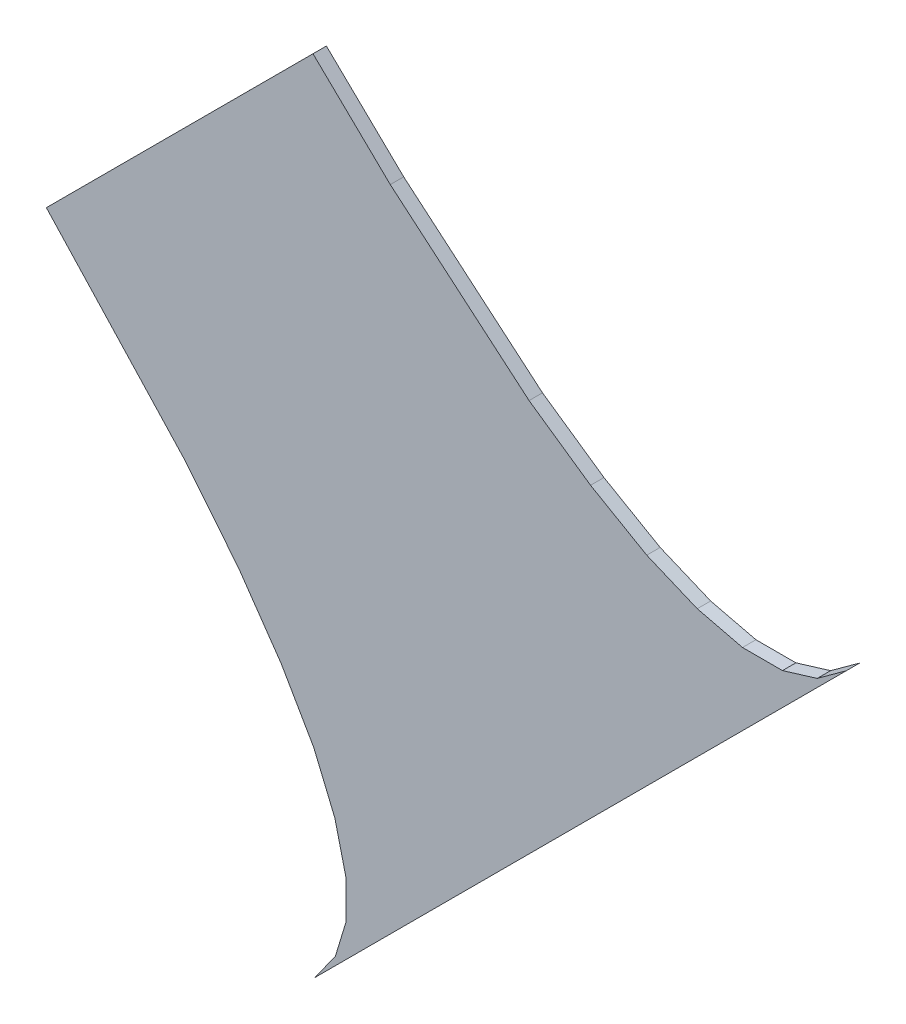
ISO-10303-21;
HEADER;
FILE_DESCRIPTION(('STEP AP214'),'2;1');
FILE_NAME('part.step','',(''),(''),'','','');
FILE_SCHEMA(('AUTOMOTIVE_DESIGN { 1 0 10303 214 1 1 1 1 }'));
ENDSEC;
DATA;
#1=APPLICATION_CONTEXT('core data for automotive mechanical design processes');
#2=APPLICATION_PROTOCOL_DEFINITION('international standard','automotive_design',2000,#1);
#3=PRODUCT_CONTEXT('',#1,'mechanical');
#4=PRODUCT('Part','Part','',(#3));
#5=PRODUCT_RELATED_PRODUCT_CATEGORY('part','',(#4));
#6=PRODUCT_DEFINITION_FORMATION('','',#4);
#7=PRODUCT_DEFINITION_CONTEXT('part definition',#1,'design');
#8=PRODUCT_DEFINITION('design','',#6,#7);
#9=PRODUCT_DEFINITION_SHAPE('','',#8);
#10=(LENGTH_UNIT() NAMED_UNIT(*) SI_UNIT(.MILLI.,.METRE.));
#11=(NAMED_UNIT(*) PLANE_ANGLE_UNIT() SI_UNIT($,.RADIAN.));
#12=(NAMED_UNIT(*) SI_UNIT($,.STERADIAN.) SOLID_ANGLE_UNIT());
#13=UNCERTAINTY_MEASURE_WITH_UNIT(LENGTH_MEASURE(1.E-05),#10,'distance_accuracy_value','');
#14=(GEOMETRIC_REPRESENTATION_CONTEXT(3) GLOBAL_UNCERTAINTY_ASSIGNED_CONTEXT((#13)) GLOBAL_UNIT_ASSIGNED_CONTEXT((#10,
#11,#12)) REPRESENTATION_CONTEXT('',''));
#15=CARTESIAN_POINT('',(0.,0.,0.));
#16=DIRECTION('',(0.,0.,1.));
#17=DIRECTION('',(1.,0.,0.));
#18=AXIS2_PLACEMENT_3D('',#15,#16,#17);
#19=CARTESIAN_POINT('',(75.6159973144531,43.9970016479492,0.));
#20=DIRECTION('',(0.733384536363359,0.67981403473531,0.));
#21=DIRECTION('',(0.67981403473531,-0.733384536363359,0.));
#22=AXIS2_PLACEMENT_3D('',#19,#20,#21);
#23=PLANE('',#22);
#24=DIRECTION('',(0.67981403473531,-0.733384536363359,0.));
#25=VECTOR('',#24,1.);
#26=CARTESIAN_POINT('',(75.6159973144531,43.9970016479492,0.03556));
#27=LINE('',#26,#25);
#28=CARTESIAN_POINT('',(75.6159973144531,43.9970016479492,0.03556));
#29=VERTEX_POINT('',#28);
#30=CARTESIAN_POINT('',(75.984001159668,43.5999984741211,0.03556));
#31=VERTEX_POINT('',#30);
#32=EDGE_CURVE('E11',#29,#31,#27,.T.);
#33=ORIENTED_EDGE('',*,*,#32,.F.);
#34=DIRECTION('',(0.,0.,1.));
#35=VECTOR('',#34,1.);
#36=CARTESIAN_POINT('',(75.6159973144531,43.9970016479492,0.));
#37=LINE('',#36,#35);
#38=CARTESIAN_POINT('',(75.6159973144531,43.9970016479492,0.));
#39=VERTEX_POINT('',#38);
#40=EDGE_CURVE('E24',#39,#29,#37,.T.);
#41=ORIENTED_EDGE('',*,*,#40,.F.);
#42=DIRECTION('',(0.67981403473531,-0.733384536363359,0.));
#43=VECTOR('',#42,1.);
#44=CARTESIAN_POINT('',(75.6159973144531,43.9970016479492,0.));
#45=LINE('',#44,#43);
#46=CARTESIAN_POINT('',(75.984001159668,43.5999984741211,0.));
#47=VERTEX_POINT('',#46);
#48=EDGE_CURVE('E172',#39,#47,#45,.T.);
#49=ORIENTED_EDGE('',*,*,#48,.T.);
#50=DIRECTION('',(0.,0.,1.));
#51=VECTOR('',#50,1.);
#52=CARTESIAN_POINT('',(75.984001159668,43.5999984741211,0.));
#53=LINE('',#52,#51);
#54=EDGE_CURVE('E37',#47,#31,#53,.T.);
#55=ORIENTED_EDGE('',*,*,#54,.T.);
#56=EDGE_LOOP('',(#33,#41,#49,#55));
#57=FACE_BOUND('',#56,.T.);
#58=ADVANCED_FACE('F17',(#57),#23,.F.);
#59=CARTESIAN_POINT('',(75.984001159668,43.5999984741211,0.));
#60=DIRECTION('',(0.778275017858157,0.627923559502179,0.));
#61=DIRECTION('',(0.627923559502179,-0.778275017858157,0.));
#62=AXIS2_PLACEMENT_3D('',#59,#60,#61);
#63=PLANE('',#62);
#64=DIRECTION('',(0.627923559502179,-0.778275017858157,0.));
#65=VECTOR('',#64,1.);
#66=CARTESIAN_POINT('',(75.984001159668,43.5999984741211,0.03556));
#67=LINE('',#66,#65);
#68=CARTESIAN_POINT('',(76.1259994506836,43.4239997863769,0.03556));
#69=VERTEX_POINT('',#68);
#70=EDGE_CURVE('E308',#31,#69,#67,.T.);
#71=ORIENTED_EDGE('',*,*,#70,.F.);
#72=ORIENTED_EDGE('',*,*,#54,.F.);
#73=DIRECTION('',(0.627923559502179,-0.778275017858157,0.));
#74=VECTOR('',#73,1.);
#75=CARTESIAN_POINT('',(75.984001159668,43.5999984741211,0.));
#76=LINE('',#75,#74);
#77=CARTESIAN_POINT('',(76.1259994506836,43.4239997863769,0.));
#78=VERTEX_POINT('',#77);
#79=EDGE_CURVE('E305',#47,#78,#76,.T.);
#80=ORIENTED_EDGE('',*,*,#79,.T.);
#81=DIRECTION('',(0.,0.,1.));
#82=VECTOR('',#81,1.);
#83=CARTESIAN_POINT('',(76.1259994506836,43.4239997863769,0.));
#84=LINE('',#83,#82);
#85=EDGE_CURVE('E303',#78,#69,#84,.T.);
#86=ORIENTED_EDGE('',*,*,#85,.T.);
#87=EDGE_LOOP('',(#71,#72,#80,#86));
#88=FACE_BOUND('',#87,.T.);
#89=ADVANCED_FACE('F316',(#88),#63,.F.);
#90=CARTESIAN_POINT('',(76.1259994506836,43.4239997863769,0.));
#91=DIRECTION('',(0.821828510702197,0.569734937490241,0.));
#92=DIRECTION('',(0.569734937490241,-0.821828510702197,0.));
#93=AXIS2_PLACEMENT_3D('',#90,#91,#92);
#94=PLANE('',#93);
#95=DIRECTION('',(0.569734937490241,-0.821828510702197,0.));
#96=VECTOR('',#95,1.);
#97=CARTESIAN_POINT('',(76.1259994506836,43.4239997863769,0.03556));
#98=LINE('',#97,#96);
#99=CARTESIAN_POINT('',(76.2389984130859,43.2610015869141,0.03556));
#100=VERTEX_POINT('',#99);
#101=EDGE_CURVE('E300',#69,#100,#98,.T.);
#102=ORIENTED_EDGE('',*,*,#101,.F.);
#103=ORIENTED_EDGE('',*,*,#85,.F.);
#104=DIRECTION('',(0.569734937490241,-0.821828510702197,0.));
#105=VECTOR('',#104,1.);
#106=CARTESIAN_POINT('',(76.1259994506836,43.4239997863769,0.));
#107=LINE('',#106,#105);
#108=CARTESIAN_POINT('',(76.2389984130859,43.2610015869141,0.));
#109=VERTEX_POINT('',#108);
#110=EDGE_CURVE('E297',#78,#109,#107,.T.);
#111=ORIENTED_EDGE('',*,*,#110,.T.);
#112=DIRECTION('',(0.,0.,1.));
#113=VECTOR('',#112,1.);
#114=CARTESIAN_POINT('',(76.2389984130859,43.2610015869141,0.));
#115=LINE('',#114,#113);
#116=EDGE_CURVE('E295',#109,#100,#115,.T.);
#117=ORIENTED_EDGE('',*,*,#116,.T.);
#118=EDGE_LOOP('',(#102,#103,#111,#117));
#119=FACE_BOUND('',#118,.T.);
#120=ADVANCED_FACE('F322',(#119),#94,.F.);
#121=CARTESIAN_POINT('',(76.2389984130859,43.2610015869141,0.));
#122=DIRECTION('',(0.866095499971792,0.499878570183412,0.));
#123=DIRECTION('',(0.499878570183412,-0.866095499971792,0.));
#124=AXIS2_PLACEMENT_3D('',#121,#122,#123);
#125=PLANE('',#124);
#126=DIRECTION('',(0.499878570183412,-0.866095499971792,0.));
#127=VECTOR('',#126,1.);
#128=CARTESIAN_POINT('',(76.2389984130859,43.2610015869141,0.03556));
#129=LINE('',#128,#127);
#130=CARTESIAN_POINT('',(76.3249969482422,43.1119995117188,0.03556));
#131=VERTEX_POINT('',#130);
#132=EDGE_CURVE('E292',#100,#131,#129,.T.);
#133=ORIENTED_EDGE('',*,*,#132,.F.);
#134=ORIENTED_EDGE('',*,*,#116,.F.);
#135=DIRECTION('',(0.499878570183412,-0.866095499971792,0.));
#136=VECTOR('',#135,1.);
#137=CARTESIAN_POINT('',(76.2389984130859,43.2610015869141,0.));
#138=LINE('',#137,#136);
#139=CARTESIAN_POINT('',(76.3249969482422,43.1119995117188,0.));
#140=VERTEX_POINT('',#139);
#141=EDGE_CURVE('E289',#109,#140,#138,.T.);
#142=ORIENTED_EDGE('',*,*,#141,.T.);
#143=DIRECTION('',(0.,0.,1.));
#144=VECTOR('',#143,1.);
#145=CARTESIAN_POINT('',(76.3249969482422,43.1119995117188,0.));
#146=LINE('',#145,#144);
#147=EDGE_CURVE('E287',#140,#131,#146,.T.);
#148=ORIENTED_EDGE('',*,*,#147,.T.);
#149=EDGE_LOOP('',(#133,#134,#142,#148));
#150=FACE_BOUND('',#149,.T.);
#151=ADVANCED_FACE('F324',(#150),#125,.F.);
#152=CARTESIAN_POINT('',(76.3249969482422,43.1119995117188,0.));
#153=DIRECTION('',(0.922668415921134,0.385594338990584,0.));
#154=DIRECTION('',(0.385594338990584,-0.922668415921134,0.));
#155=AXIS2_PLACEMENT_3D('',#152,#153,#154);
#156=PLANE('',#155);
#157=DIRECTION('',(0.385594338990584,-0.922668415921134,0.));
#158=VECTOR('',#157,1.);
#159=CARTESIAN_POINT('',(76.3249969482422,43.1119995117188,0.03556));
#160=LINE('',#159,#158);
#161=CARTESIAN_POINT('',(76.3809967041016,42.9780006408691,0.03556));
#162=VERTEX_POINT('',#161);
#163=EDGE_CURVE('E284',#131,#162,#160,.T.);
#164=ORIENTED_EDGE('',*,*,#163,.F.);
#165=ORIENTED_EDGE('',*,*,#147,.F.);
#166=DIRECTION('',(0.385594338990584,-0.922668415921134,0.));
#167=VECTOR('',#166,1.);
#168=CARTESIAN_POINT('',(76.3249969482422,43.1119995117188,0.));
#169=LINE('',#168,#167);
#170=CARTESIAN_POINT('',(76.3809967041016,42.9780006408691,0.));
#171=VERTEX_POINT('',#170);
#172=EDGE_CURVE('E281',#140,#171,#169,.T.);
#173=ORIENTED_EDGE('',*,*,#172,.T.);
#174=DIRECTION('',(0.,0.,1.));
#175=VECTOR('',#174,1.);
#176=CARTESIAN_POINT('',(76.3809967041016,42.9780006408691,0.));
#177=LINE('',#176,#175);
#178=EDGE_CURVE('E279',#171,#162,#177,.T.);
#179=ORIENTED_EDGE('',*,*,#178,.T.);
#180=EDGE_LOOP('',(#164,#165,#173,#179));
#181=FACE_BOUND('',#180,.T.);
#182=ADVANCED_FACE('F329',(#181),#156,.F.);
#183=CARTESIAN_POINT('',(76.3809967041016,42.9780006408692,0.));
#184=DIRECTION('',(0.972005115773933,0.234959687838795,0.));
#185=DIRECTION('',(0.234959687838795,-0.972005115773933,0.));
#186=AXIS2_PLACEMENT_3D('',#183,#184,#185);
#187=PLANE('',#186);
#188=DIRECTION('',(0.234959687838795,-0.972005115773932,0.));
#189=VECTOR('',#188,1.);
#190=CARTESIAN_POINT('',(76.3809967041016,42.9780006408691,0.03556));
#191=LINE('',#190,#189);
#192=CARTESIAN_POINT('',(76.4100036621094,42.8580017089844,0.03556));
#193=VERTEX_POINT('',#192);
#194=EDGE_CURVE('E276',#162,#193,#191,.T.);
#195=ORIENTED_EDGE('',*,*,#194,.F.);
#196=ORIENTED_EDGE('',*,*,#178,.F.);
#197=DIRECTION('',(0.234959687838795,-0.972005115773932,0.));
#198=VECTOR('',#197,1.);
#199=CARTESIAN_POINT('',(76.3809967041016,42.9780006408691,0.));
#200=LINE('',#199,#198);
#201=CARTESIAN_POINT('',(76.4100036621094,42.8580017089844,0.));
#202=VERTEX_POINT('',#201);
#203=EDGE_CURVE('E273',#171,#202,#200,.T.);
#204=ORIENTED_EDGE('',*,*,#203,.T.);
#205=DIRECTION('',(0.,0.,1.));
#206=VECTOR('',#205,1.);
#207=CARTESIAN_POINT('',(76.4100036621094,42.8580017089844,0.));
#208=LINE('',#207,#206);
#209=EDGE_CURVE('E271',#202,#193,#208,.T.);
#210=ORIENTED_EDGE('',*,*,#209,.T.);
#211=EDGE_LOOP('',(#195,#196,#204,#210));
#212=FACE_BOUND('',#211,.T.);
#213=ADVANCED_FACE('F332',(#212),#187,.F.);
#214=CARTESIAN_POINT('',(76.4100036621094,42.8580017089844,0.));
#215=DIRECTION('',(1.,0.,0.));
#216=DIRECTION('',(0.,-1.,0.));
#217=AXIS2_PLACEMENT_3D('',#214,#215,#216);
#218=PLANE('',#217);
#219=DIRECTION('',(0.,-1.,0.));
#220=VECTOR('',#219,1.);
#221=CARTESIAN_POINT('',(76.4100036621094,42.8580017089844,0.03556));
#222=LINE('',#221,#220);
#223=CARTESIAN_POINT('',(76.4100036621094,42.7519989013672,0.03556));
#224=VERTEX_POINT('',#223);
#225=EDGE_CURVE('E268',#193,#224,#222,.T.);
#226=ORIENTED_EDGE('',*,*,#225,.F.);
#227=ORIENTED_EDGE('',*,*,#209,.F.);
#228=DIRECTION('',(0.,-1.,0.));
#229=VECTOR('',#228,1.);
#230=CARTESIAN_POINT('',(76.4100036621094,42.8580017089844,0.));
#231=LINE('',#230,#229);
#232=CARTESIAN_POINT('',(76.4100036621094,42.7519989013672,0.));
#233=VERTEX_POINT('',#232);
#234=EDGE_CURVE('E265',#202,#233,#231,.T.);
#235=ORIENTED_EDGE('',*,*,#234,.T.);
#236=DIRECTION('',(0.,0.,1.));
#237=VECTOR('',#236,1.);
#238=CARTESIAN_POINT('',(76.4100036621094,42.7519989013672,0.));
#239=LINE('',#238,#237);
#240=EDGE_CURVE('E263',#233,#224,#239,.T.);
#241=ORIENTED_EDGE('',*,*,#240,.T.);
#242=EDGE_LOOP('',(#226,#227,#235,#241));
#243=FACE_BOUND('',#242,.T.);
#244=ADVANCED_FACE('F337',(#243),#218,.F.);
#245=CARTESIAN_POINT('',(76.4100036621094,42.7519989013672,0.));
#246=DIRECTION('',(0.956673400019129,-0.291163194267131,0.));
#247=DIRECTION('',(-0.291163194267131,-0.956673400019129,0.));
#248=AXIS2_PLACEMENT_3D('',#245,#246,#247);
#249=PLANE('',#248);
#250=DIRECTION('',(-0.291163194267131,-0.956673400019129,0.));
#251=VECTOR('',#250,1.);
#252=CARTESIAN_POINT('',(76.4100036621094,42.7519989013672,0.03556));
#253=LINE('',#252,#251);
#254=CARTESIAN_POINT('',(76.3820037841797,42.6599998474121,0.03556));
#255=VERTEX_POINT('',#254);
#256=EDGE_CURVE('E260',#224,#255,#253,.T.);
#257=ORIENTED_EDGE('',*,*,#256,.F.);
#258=ORIENTED_EDGE('',*,*,#240,.F.);
#259=DIRECTION('',(-0.291163194267131,-0.956673400019129,0.));
#260=VECTOR('',#259,1.);
#261=CARTESIAN_POINT('',(76.4100036621094,42.7519989013672,0.));
#262=LINE('',#261,#260);
#263=CARTESIAN_POINT('',(76.3820037841797,42.6599998474121,0.));
#264=VERTEX_POINT('',#263);
#265=EDGE_CURVE('E257',#233,#264,#262,.T.);
#266=ORIENTED_EDGE('',*,*,#265,.T.);
#267=DIRECTION('',(0.,0.,1.));
#268=VECTOR('',#267,1.);
#269=CARTESIAN_POINT('',(76.3820037841797,42.6599998474121,0.));
#270=LINE('',#269,#268);
#271=EDGE_CURVE('E255',#264,#255,#270,.T.);
#272=ORIENTED_EDGE('',*,*,#271,.T.);
#273=EDGE_LOOP('',(#257,#258,#266,#272));
#274=FACE_BOUND('',#273,.T.);
#275=ADVANCED_FACE('F340',(#274),#249,.F.);
#276=CARTESIAN_POINT('',(76.3820037841797,42.6599998474121,0.));
#277=DIRECTION('',(0.808697967375746,-0.588224104880391,0.));
#278=DIRECTION('',(-0.588224104880391,-0.808697967375746,0.));
#279=AXIS2_PLACEMENT_3D('',#276,#277,#278);
#280=PLANE('',#279);
#281=DIRECTION('',(-0.588224104880391,-0.808697967375746,0.));
#282=VECTOR('',#281,1.);
#283=CARTESIAN_POINT('',(76.3820037841797,42.6599998474121,0.03556));
#284=LINE('',#283,#282);
#285=CARTESIAN_POINT('',(76.3259963989258,42.5830001831055,0.03556));
#286=VERTEX_POINT('',#285);
#287=EDGE_CURVE('E252',#255,#286,#284,.T.);
#288=ORIENTED_EDGE('',*,*,#287,.F.);
#289=ORIENTED_EDGE('',*,*,#271,.F.);
#290=DIRECTION('',(-0.588224104880391,-0.808697967375746,0.));
#291=VECTOR('',#290,1.);
#292=CARTESIAN_POINT('',(76.3820037841797,42.6599998474121,0.));
#293=LINE('',#292,#291);
#294=CARTESIAN_POINT('',(76.3259963989258,42.5830001831055,0.));
#295=VERTEX_POINT('',#294);
#296=EDGE_CURVE('E249',#264,#295,#293,.T.);
#297=ORIENTED_EDGE('',*,*,#296,.T.);
#298=DIRECTION('',(0.,0.,1.));
#299=VECTOR('',#298,1.);
#300=CARTESIAN_POINT('',(76.3259963989258,42.5830001831055,0.));
#301=LINE('',#300,#299);
#302=EDGE_CURVE('E247',#295,#286,#301,.T.);
#303=ORIENTED_EDGE('',*,*,#302,.T.);
#304=EDGE_LOOP('',(#288,#289,#297,#303));
#305=FACE_BOUND('',#304,.T.);
#306=ADVANCED_FACE('F345',(#305),#280,.F.);
#307=CARTESIAN_POINT('',(76.3259963989258,42.5830001831055,0.));
#308=DIRECTION('',(-0.707105825340402,0.707107737031401,0.));
#309=DIRECTION('',(0.707107737031401,0.707105825340402,0.));
#310=AXIS2_PLACEMENT_3D('',#307,#308,#309);
#311=PLANE('',#310);
#312=DIRECTION('',(0.707107737031401,0.707105825340402,0.));
#313=VECTOR('',#312,1.);
#314=CARTESIAN_POINT('',(76.3259963989258,42.5830001831055,0.03556));
#315=LINE('',#314,#313);
#316=CARTESIAN_POINT('',(77.7369995117188,43.9939994812012,0.03556));
#317=VERTEX_POINT('',#316);
#318=EDGE_CURVE('E244',#286,#317,#315,.T.);
#319=ORIENTED_EDGE('',*,*,#318,.F.);
#320=ORIENTED_EDGE('',*,*,#302,.F.);
#321=DIRECTION('',(0.707107737031401,0.707105825340402,0.));
#322=VECTOR('',#321,1.);
#323=CARTESIAN_POINT('',(76.3259963989258,42.5830001831055,0.));
#324=LINE('',#323,#322);
#325=CARTESIAN_POINT('',(77.7369995117188,43.9939994812012,0.));
#326=VERTEX_POINT('',#325);
#327=EDGE_CURVE('E241',#295,#326,#324,.T.);
#328=ORIENTED_EDGE('',*,*,#327,.T.);
#329=DIRECTION('',(0.,0.,1.));
#330=VECTOR('',#329,1.);
#331=CARTESIAN_POINT('',(77.7369995117188,43.9939994812012,0.));
#332=LINE('',#331,#330);
#333=EDGE_CURVE('E239',#326,#317,#332,.T.);
#334=ORIENTED_EDGE('',*,*,#333,.T.);
#335=EDGE_LOOP('',(#319,#320,#328,#334));
#336=FACE_BOUND('',#335,.T.);
#337=ADVANCED_FACE('F348',(#336),#311,.F.);
#338=CARTESIAN_POINT('',(77.7369995117188,43.9939994812012,0.));
#339=DIRECTION('',(0.588190756642206,-0.808722222892799,0.));
#340=DIRECTION('',(-0.808722222892799,-0.588190756642206,0.));
#341=AXIS2_PLACEMENT_3D('',#338,#339,#340);
#342=PLANE('',#341);
#343=DIRECTION('',(-0.808722222892799,-0.588190756642206,0.));
#344=VECTOR('',#343,1.);
#345=CARTESIAN_POINT('',(77.7369995117188,43.9939994812012,0.03556));
#346=LINE('',#345,#344);
#347=CARTESIAN_POINT('',(77.6600036621094,43.9379997253418,0.03556));
#348=VERTEX_POINT('',#347);
#349=EDGE_CURVE('E236',#317,#348,#346,.T.);
#350=ORIENTED_EDGE('',*,*,#349,.F.);
#351=ORIENTED_EDGE('',*,*,#333,.F.);
#352=DIRECTION('',(-0.808722222892799,-0.588190756642206,0.));
#353=VECTOR('',#352,1.);
#354=CARTESIAN_POINT('',(77.7369995117188,43.9939994812012,0.));
#355=LINE('',#354,#353);
#356=CARTESIAN_POINT('',(77.6600036621094,43.9379997253418,0.));
#357=VERTEX_POINT('',#356);
#358=EDGE_CURVE('E233',#326,#357,#355,.T.);
#359=ORIENTED_EDGE('',*,*,#358,.T.);
#360=DIRECTION('',(0.,0.,1.));
#361=VECTOR('',#360,1.);
#362=CARTESIAN_POINT('',(77.6600036621094,43.9379997253418,0.));
#363=LINE('',#362,#361);
#364=EDGE_CURVE('E231',#357,#348,#363,.T.);
#365=ORIENTED_EDGE('',*,*,#364,.T.);
#366=EDGE_LOOP('',(#350,#351,#359,#365));
#367=FACE_BOUND('',#366,.T.);
#368=ADVANCED_FACE('F353',(#367),#342,.F.);
#369=CARTESIAN_POINT('',(77.6600036621094,43.9379997253418,0.));
#370=DIRECTION('',(0.291152145218841,-0.956676762723161,0.));
#371=DIRECTION('',(-0.956676762723161,-0.291152145218841,0.));
#372=AXIS2_PLACEMENT_3D('',#369,#370,#371);
#373=PLANE('',#372);
#374=DIRECTION('',(-0.956676762723161,-0.291152145218841,0.));
#375=VECTOR('',#374,1.);
#376=CARTESIAN_POINT('',(77.6600036621094,43.9379997253418,0.03556));
#377=LINE('',#376,#375);
#378=CARTESIAN_POINT('',(77.568000793457,43.9099998474121,0.03556));
#379=VERTEX_POINT('',#378);
#380=EDGE_CURVE('E228',#348,#379,#377,.T.);
#381=ORIENTED_EDGE('',*,*,#380,.F.);
#382=ORIENTED_EDGE('',*,*,#364,.F.);
#383=DIRECTION('',(-0.956676762723161,-0.291152145218841,0.));
#384=VECTOR('',#383,1.);
#385=CARTESIAN_POINT('',(77.6600036621094,43.9379997253418,0.));
#386=LINE('',#385,#384);
#387=CARTESIAN_POINT('',(77.568000793457,43.9099998474121,0.));
#388=VERTEX_POINT('',#387);
#389=EDGE_CURVE('E225',#357,#388,#386,.T.);
#390=ORIENTED_EDGE('',*,*,#389,.T.);
#391=DIRECTION('',(0.,0.,1.));
#392=VECTOR('',#391,1.);
#393=CARTESIAN_POINT('',(77.568000793457,43.9099998474121,0.));
#394=LINE('',#393,#392);
#395=EDGE_CURVE('E223',#388,#379,#394,.T.);
#396=ORIENTED_EDGE('',*,*,#395,.T.);
#397=EDGE_LOOP('',(#381,#382,#390,#396));
#398=FACE_BOUND('',#397,.T.);
#399=ADVANCED_FACE('F356',(#398),#373,.F.);
#400=CARTESIAN_POINT('',(77.568000793457,43.9099998474121,0.));
#401=DIRECTION('',(0.,-1.,0.));
#402=DIRECTION('',(-1.,0.,0.));
#403=AXIS2_PLACEMENT_3D('',#400,#401,#402);
#404=PLANE('',#403);
#405=DIRECTION('',(-1.,0.,0.));
#406=VECTOR('',#405,1.);
#407=CARTESIAN_POINT('',(77.568000793457,43.9099998474121,0.03556));
#408=LINE('',#407,#406);
#409=CARTESIAN_POINT('',(77.4619979858398,43.9099998474121,0.03556));
#410=VERTEX_POINT('',#409);
#411=EDGE_CURVE('E220',#379,#410,#408,.T.);
#412=ORIENTED_EDGE('',*,*,#411,.F.);
#413=ORIENTED_EDGE('',*,*,#395,.F.);
#414=DIRECTION('',(-1.,0.,0.));
#415=VECTOR('',#414,1.);
#416=CARTESIAN_POINT('',(77.568000793457,43.9099998474121,0.));
#417=LINE('',#416,#415);
#418=CARTESIAN_POINT('',(77.4619979858398,43.9099998474121,0.));
#419=VERTEX_POINT('',#418);
#420=EDGE_CURVE('E217',#388,#419,#417,.T.);
#421=ORIENTED_EDGE('',*,*,#420,.T.);
#422=DIRECTION('',(0.,0.,1.));
#423=VECTOR('',#422,1.);
#424=CARTESIAN_POINT('',(77.4619979858398,43.9099998474121,0.));
#425=LINE('',#424,#423);
#426=EDGE_CURVE('E215',#419,#410,#425,.T.);
#427=ORIENTED_EDGE('',*,*,#426,.T.);
#428=EDGE_LOOP('',(#412,#413,#421,#427));
#429=FACE_BOUND('',#428,.T.);
#430=ADVANCED_FACE('F361',(#429),#404,.F.);
#431=CARTESIAN_POINT('',(77.4619979858398,43.9099998474121,0.));
#432=DIRECTION('',(-0.234908354817336,-0.972017522906358,0.));
#433=DIRECTION('',(-0.972017522906358,0.234908354817336,0.));
#434=AXIS2_PLACEMENT_3D('',#431,#432,#433);
#435=PLANE('',#434);
#436=DIRECTION('',(-0.972017522906358,0.234908354817336,0.));
#437=VECTOR('',#436,1.);
#438=CARTESIAN_POINT('',(77.4619979858398,43.9099998474121,0.03556));
#439=LINE('',#438,#437);
#440=CARTESIAN_POINT('',(77.3420028686523,43.9389991760254,0.03556));
#441=VERTEX_POINT('',#440);
#442=EDGE_CURVE('E212',#410,#441,#439,.T.);
#443=ORIENTED_EDGE('',*,*,#442,.F.);
#444=ORIENTED_EDGE('',*,*,#426,.F.);
#445=DIRECTION('',(-0.972017522906358,0.234908354817336,0.));
#446=VECTOR('',#445,1.);
#447=CARTESIAN_POINT('',(77.4619979858398,43.9099998474121,0.));
#448=LINE('',#447,#446);
#449=CARTESIAN_POINT('',(77.3420028686523,43.9389991760254,0.));
#450=VERTEX_POINT('',#449);
#451=EDGE_CURVE('E209',#419,#450,#448,.T.);
#452=ORIENTED_EDGE('',*,*,#451,.T.);
#453=DIRECTION('',(0.,0.,1.));
#454=VECTOR('',#453,1.);
#455=CARTESIAN_POINT('',(77.3420028686523,43.9389991760254,0.));
#456=LINE('',#455,#454);
#457=EDGE_CURVE('E207',#450,#441,#456,.T.);
#458=ORIENTED_EDGE('',*,*,#457,.T.);
#459=EDGE_LOOP('',(#443,#444,#452,#458));
#460=FACE_BOUND('',#459,.T.);
#461=ADVANCED_FACE('F364',(#460),#435,.F.);
#462=CARTESIAN_POINT('',(77.3420028686524,43.9389991760254,0.));
#463=DIRECTION('',(-0.385584994163033,-0.922672321182495,0.));
#464=DIRECTION('',(-0.922672321182495,0.385584994163033,0.));
#465=AXIS2_PLACEMENT_3D('',#462,#463,#464);
#466=PLANE('',#465);
#467=DIRECTION('',(-0.922672321182495,0.385584994163033,0.));
#468=VECTOR('',#467,1.);
#469=CARTESIAN_POINT('',(77.3420028686523,43.9389991760254,0.03556));
#470=LINE('',#469,#468);
#471=CARTESIAN_POINT('',(77.2080001831055,43.9949989318848,0.03556));
#472=VERTEX_POINT('',#471);
#473=EDGE_CURVE('E204',#441,#472,#470,.T.);
#474=ORIENTED_EDGE('',*,*,#473,.F.);
#475=ORIENTED_EDGE('',*,*,#457,.F.);
#476=DIRECTION('',(-0.922672321182495,0.385584994163033,0.));
#477=VECTOR('',#476,1.);
#478=CARTESIAN_POINT('',(77.3420028686523,43.9389991760254,0.));
#479=LINE('',#478,#477);
#480=CARTESIAN_POINT('',(77.2080001831055,43.9949989318848,0.));
#481=VERTEX_POINT('',#480);
#482=EDGE_CURVE('E201',#450,#481,#479,.T.);
#483=ORIENTED_EDGE('',*,*,#482,.T.);
#484=DIRECTION('',(0.,0.,1.));
#485=VECTOR('',#484,1.);
#486=CARTESIAN_POINT('',(77.2080001831055,43.9949989318848,0.));
#487=LINE('',#486,#485);
#488=EDGE_CURVE('E199',#481,#472,#487,.T.);
#489=ORIENTED_EDGE('',*,*,#488,.T.);
#490=EDGE_LOOP('',(#474,#475,#483,#489));
#491=FACE_BOUND('',#490,.T.);
#492=ADVANCED_FACE('F369',(#491),#466,.F.);
#493=CARTESIAN_POINT('',(77.2080001831055,43.9949989318848,0.));
#494=DIRECTION('',(-0.499895202696994,-0.866085900081817,0.));
#495=DIRECTION('',(-0.866085900081817,0.499895202696994,0.));
#496=AXIS2_PLACEMENT_3D('',#493,#494,#495);
#497=PLANE('',#496);
#498=DIRECTION('',(-0.866085900081817,0.499895202696994,0.));
#499=VECTOR('',#498,1.);
#500=CARTESIAN_POINT('',(77.2080001831055,43.9949989318848,0.03556));
#501=LINE('',#500,#499);
#502=CARTESIAN_POINT('',(77.0589981079102,44.0810012817383,0.03556));
#503=VERTEX_POINT('',#502);
#504=EDGE_CURVE('E196',#472,#503,#501,.T.);
#505=ORIENTED_EDGE('',*,*,#504,.F.);
#506=ORIENTED_EDGE('',*,*,#488,.F.);
#507=DIRECTION('',(-0.866085900081817,0.499895202696994,0.));
#508=VECTOR('',#507,1.);
#509=CARTESIAN_POINT('',(77.2080001831055,43.9949989318848,0.));
#510=LINE('',#509,#508);
#511=CARTESIAN_POINT('',(77.0589981079102,44.0810012817383,0.));
#512=VERTEX_POINT('',#511);
#513=EDGE_CURVE('E193',#481,#512,#510,.T.);
#514=ORIENTED_EDGE('',*,*,#513,.T.);
#515=DIRECTION('',(0.,0.,1.));
#516=VECTOR('',#515,1.);
#517=CARTESIAN_POINT('',(77.0589981079102,44.0810012817383,0.));
#518=LINE('',#517,#516);
#519=EDGE_CURVE('E191',#512,#503,#518,.T.);
#520=ORIENTED_EDGE('',*,*,#519,.T.);
#521=EDGE_LOOP('',(#505,#506,#514,#520));
#522=FACE_BOUND('',#521,.T.);
#523=ADVANCED_FACE('F372',(#522),#497,.F.);
#524=CARTESIAN_POINT('',(77.0589981079102,44.0810012817383,0.));
#525=DIRECTION('',(-0.569743943195841,-0.821822267398282,0.));
#526=DIRECTION('',(-0.821822267398282,0.569743943195841,0.));
#527=AXIS2_PLACEMENT_3D('',#524,#525,#526);
#528=PLANE('',#527);
#529=DIRECTION('',(-0.821822267398282,0.569743943195841,0.));
#530=VECTOR('',#529,1.);
#531=CARTESIAN_POINT('',(77.0589981079102,44.0810012817383,0.03556));
#532=LINE('',#531,#530);
#533=CARTESIAN_POINT('',(76.8960037231445,44.1940002441406,0.03556));
#534=VERTEX_POINT('',#533);
#535=EDGE_CURVE('E188',#503,#534,#532,.T.);
#536=ORIENTED_EDGE('',*,*,#535,.F.);
#537=ORIENTED_EDGE('',*,*,#519,.F.);
#538=DIRECTION('',(-0.821822267398282,0.569743943195841,0.));
#539=VECTOR('',#538,1.);
#540=CARTESIAN_POINT('',(77.0589981079102,44.0810012817383,0.));
#541=LINE('',#540,#539);
#542=CARTESIAN_POINT('',(76.8960037231445,44.1940002441406,0.));
#543=VERTEX_POINT('',#542);
#544=EDGE_CURVE('E185',#512,#543,#541,.T.);
#545=ORIENTED_EDGE('',*,*,#544,.T.);
#546=DIRECTION('',(0.,0.,1.));
#547=VECTOR('',#546,1.);
#548=CARTESIAN_POINT('',(76.8960037231445,44.1940002441406,0.));
#549=LINE('',#548,#547);
#550=EDGE_CURVE('E183',#543,#534,#549,.T.);
#551=ORIENTED_EDGE('',*,*,#550,.T.);
#552=EDGE_LOOP('',(#536,#537,#545,#551));
#553=FACE_BOUND('',#552,.T.);
#554=ADVANCED_FACE('F377',(#553),#528,.F.);
#555=CARTESIAN_POINT('',(76.8960037231445,44.1940002441406,0.));
#556=DIRECTION('',(-0.646681651543645,-0.762760015704012,0.));
#557=DIRECTION('',(-0.762760015704012,0.646681651543645,0.));
#558=AXIS2_PLACEMENT_3D('',#555,#556,#557);
#559=PLANE('',#558);
#560=DIRECTION('',(-0.762760015704012,0.646681651543645,0.));
#561=VECTOR('',#560,1.);
#562=CARTESIAN_POINT('',(76.8960037231445,44.1940002441406,0.03556));
#563=LINE('',#562,#561);
#564=CARTESIAN_POINT('',(76.5279998779297,44.5060005187988,0.03556));
#565=VERTEX_POINT('',#564);
#566=EDGE_CURVE('E180',#534,#565,#563,.T.);
#567=ORIENTED_EDGE('',*,*,#566,.F.);
#568=ORIENTED_EDGE('',*,*,#550,.F.);
#569=DIRECTION('',(-0.762760015704012,0.646681651543645,0.));
#570=VECTOR('',#569,1.);
#571=CARTESIAN_POINT('',(76.8960037231445,44.1940002441406,0.));
#572=LINE('',#571,#570);
#573=CARTESIAN_POINT('',(76.5279998779297,44.5060005187988,0.));
#574=VERTEX_POINT('',#573);
#575=EDGE_CURVE('E178',#543,#574,#572,.T.);
#576=ORIENTED_EDGE('',*,*,#575,.T.);
#577=DIRECTION('',(0.,0.,1.));
#578=VECTOR('',#577,1.);
#579=CARTESIAN_POINT('',(76.5279998779297,44.5060005187988,0.));
#580=LINE('',#579,#578);
#581=EDGE_CURVE('E163',#574,#565,#580,.T.);
#582=ORIENTED_EDGE('',*,*,#581,.T.);
#583=EDGE_LOOP('',(#567,#568,#576,#582));
#584=FACE_BOUND('',#583,.T.);
#585=ADVANCED_FACE('F379',(#584),#559,.F.);
#586=CARTESIAN_POINT('',(76.5279998779297,44.5060005187988,0.));
#587=DIRECTION('',(-0.694712980419731,-0.71928706010628,0.));
#588=DIRECTION('',(-0.71928706010628,0.694712980419731,0.));
#589=AXIS2_PLACEMENT_3D('',#586,#587,#588);
#590=PLANE('',#589);
#591=DIRECTION('',(-0.71928706010628,0.694712980419731,0.));
#592=VECTOR('',#591,1.);
#593=CARTESIAN_POINT('',(76.5279998779297,44.5060005187988,0.03556));
#594=LINE('',#593,#592);
#595=CARTESIAN_POINT('',(76.322998046875,44.7039985656738,0.03556));
#596=VERTEX_POINT('',#595);
#597=EDGE_CURVE('E167',#565,#596,#594,.T.);
#598=ORIENTED_EDGE('',*,*,#597,.F.);
#599=ORIENTED_EDGE('',*,*,#581,.F.);
#600=DIRECTION('',(-0.71928706010628,0.694712980419731,0.));
#601=VECTOR('',#600,1.);
#602=CARTESIAN_POINT('',(76.5279998779297,44.5060005187988,0.));
#603=LINE('',#602,#601);
#604=CARTESIAN_POINT('',(76.322998046875,44.7039985656738,0.));
#605=VERTEX_POINT('',#604);
#606=EDGE_CURVE('E159',#574,#605,#603,.T.);
#607=ORIENTED_EDGE('',*,*,#606,.T.);
#608=DIRECTION('',(0.,0.,1.));
#609=VECTOR('',#608,1.);
#610=CARTESIAN_POINT('',(76.322998046875,44.7039985656738,0.));
#611=LINE('',#610,#609);
#612=EDGE_CURVE('E149',#605,#596,#611,.T.);
#613=ORIENTED_EDGE('',*,*,#612,.T.);
#614=EDGE_LOOP('',(#598,#599,#607,#613));
#615=FACE_BOUND('',#614,.T.);
#616=ADVANCED_FACE('F162',(#615),#590,.F.);
#617=CARTESIAN_POINT('',(76.322998046875,44.7039985656738,0.));
#618=DIRECTION('',(0.707104873544097,-0.707108688823852,0.));
#619=DIRECTION('',(-0.707108688823852,-0.707104873544097,0.));
#620=AXIS2_PLACEMENT_3D('',#617,#618,#619);
#621=PLANE('',#620);
#622=DIRECTION('',(-0.707108688823852,-0.707104873544096,0.));
#623=VECTOR('',#622,1.);
#624=CARTESIAN_POINT('',(76.322998046875,44.7039985656738,0.03556));
#625=LINE('',#624,#623);
#626=EDGE_CURVE('E155',#596,#29,#625,.T.);
#627=ORIENTED_EDGE('',*,*,#626,.F.);
#628=ORIENTED_EDGE('',*,*,#612,.F.);
#629=DIRECTION('',(-0.707108688823852,-0.707104873544096,0.));
#630=VECTOR('',#629,1.);
#631=CARTESIAN_POINT('',(76.322998046875,44.7039985656738,0.));
#632=LINE('',#631,#630);
#633=EDGE_CURVE('E153',#605,#39,#632,.T.);
#634=ORIENTED_EDGE('',*,*,#633,.T.);
#635=ORIENTED_EDGE('',*,*,#40,.T.);
#636=EDGE_LOOP('',(#627,#628,#634,#635));
#637=FACE_BOUND('',#636,.T.);
#638=ADVANCED_FACE('F151',(#637),#621,.F.);
#639=CARTESIAN_POINT('',(75.6159973144531,43.9970016479492,0.));
#640=DIRECTION('',(0.,0.,1.));
#641=DIRECTION('',(1.,0.,0.));
#642=AXIS2_PLACEMENT_3D('',#639,#640,#641);
#643=PLANE('',#642);
#644=ORIENTED_EDGE('',*,*,#633,.F.);
#645=ORIENTED_EDGE('',*,*,#606,.F.);
#646=ORIENTED_EDGE('',*,*,#575,.F.);
#647=ORIENTED_EDGE('',*,*,#544,.F.);
#648=ORIENTED_EDGE('',*,*,#513,.F.);
#649=ORIENTED_EDGE('',*,*,#482,.F.);
#650=ORIENTED_EDGE('',*,*,#451,.F.);
#651=ORIENTED_EDGE('',*,*,#420,.F.);
#652=ORIENTED_EDGE('',*,*,#389,.F.);
#653=ORIENTED_EDGE('',*,*,#358,.F.);
#654=ORIENTED_EDGE('',*,*,#327,.F.);
#655=ORIENTED_EDGE('',*,*,#296,.F.);
#656=ORIENTED_EDGE('',*,*,#265,.F.);
#657=ORIENTED_EDGE('',*,*,#234,.F.);
#658=ORIENTED_EDGE('',*,*,#203,.F.);
#659=ORIENTED_EDGE('',*,*,#172,.F.);
#660=ORIENTED_EDGE('',*,*,#141,.F.);
#661=ORIENTED_EDGE('',*,*,#110,.F.);
#662=ORIENTED_EDGE('',*,*,#79,.F.);
#663=ORIENTED_EDGE('',*,*,#48,.F.);
#664=EDGE_LOOP('',(#644,#645,#646,#647,#648,#649,#650,#651,#652,#653,#654,#655,#656,#657,#658,
#659,#660,#661,#662,#663));
#665=FACE_BOUND('',#664,.T.);
#666=ADVANCED_FACE('F170',(#665),#643,.F.);
#667=CARTESIAN_POINT('',(75.6159973144531,43.9970016479492,0.03556));
#668=DIRECTION('',(0.,0.,1.));
#669=DIRECTION('',(1.,0.,0.));
#670=AXIS2_PLACEMENT_3D('',#667,#668,#669);
#671=PLANE('',#670);
#672=ORIENTED_EDGE('',*,*,#32,.T.);
#673=ORIENTED_EDGE('',*,*,#70,.T.);
#674=ORIENTED_EDGE('',*,*,#101,.T.);
#675=ORIENTED_EDGE('',*,*,#132,.T.);
#676=ORIENTED_EDGE('',*,*,#163,.T.);
#677=ORIENTED_EDGE('',*,*,#194,.T.);
#678=ORIENTED_EDGE('',*,*,#225,.T.);
#679=ORIENTED_EDGE('',*,*,#256,.T.);
#680=ORIENTED_EDGE('',*,*,#287,.T.);
#681=ORIENTED_EDGE('',*,*,#318,.T.);
#682=ORIENTED_EDGE('',*,*,#349,.T.);
#683=ORIENTED_EDGE('',*,*,#380,.T.);
#684=ORIENTED_EDGE('',*,*,#411,.T.);
#685=ORIENTED_EDGE('',*,*,#442,.T.);
#686=ORIENTED_EDGE('',*,*,#473,.T.);
#687=ORIENTED_EDGE('',*,*,#504,.T.);
#688=ORIENTED_EDGE('',*,*,#535,.T.);
#689=ORIENTED_EDGE('',*,*,#566,.T.);
#690=ORIENTED_EDGE('',*,*,#597,.T.);
#691=ORIENTED_EDGE('',*,*,#626,.T.);
#692=EDGE_LOOP('',(#672,#673,#674,#675,#676,#677,#678,#679,#680,#681,#682,#683,#684,#685,#686,
#687,#688,#689,#690,#691));
#693=FACE_BOUND('',#692,.T.);
#694=ADVANCED_FACE('F319',(#693),#671,.T.);
#695=CLOSED_SHELL('',(#58,#89,#120,#151,#182,#213,#244,#275,#306,#337,#368,#399,#430,#461,#492,
#523,#554,#585,#616,#638,#666,#694));
#696=MANIFOLD_SOLID_BREP('B1',#695);
#697=ADVANCED_BREP_SHAPE_REPRESENTATION('',(#18,#696),#14);
#698=SHAPE_DEFINITION_REPRESENTATION(#9,#697);
ENDSEC;
END-ISO-10303-21;
